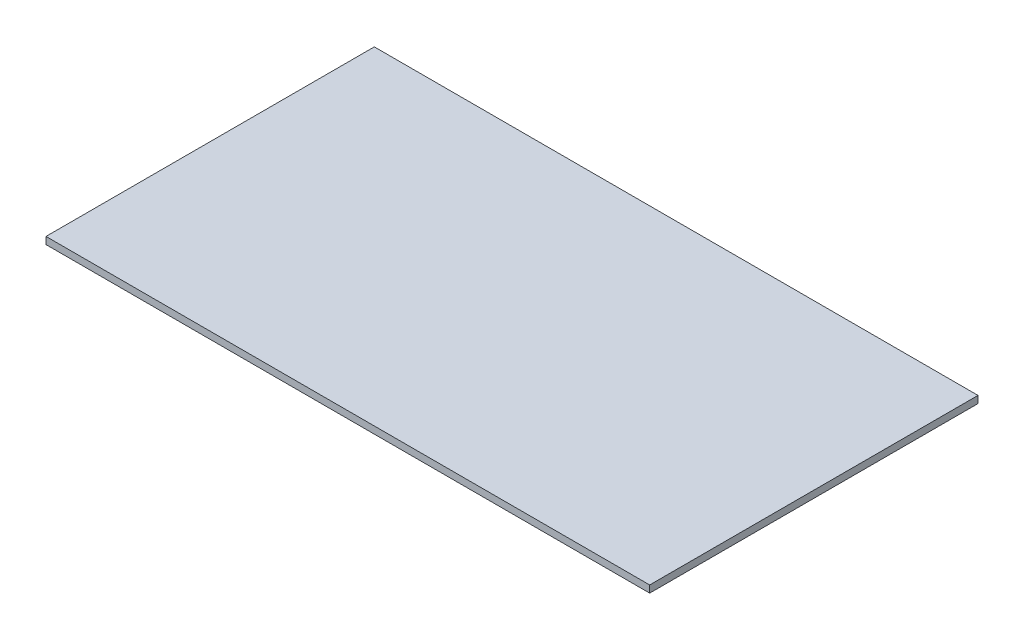
ISO-10303-21;
HEADER;
FILE_DESCRIPTION(('STEP AP214'),'2;1');
FILE_NAME('part.step','',(''),(''),'','','');
FILE_SCHEMA(('AUTOMOTIVE_DESIGN { 1 0 10303 214 1 1 1 1 }'));
ENDSEC;
DATA;
#1=APPLICATION_CONTEXT('core data for automotive mechanical design processes');
#2=APPLICATION_PROTOCOL_DEFINITION('international standard','automotive_design',2000,#1);
#3=PRODUCT_CONTEXT('',#1,'mechanical');
#4=PRODUCT('Part','Part','',(#3));
#5=PRODUCT_RELATED_PRODUCT_CATEGORY('part','',(#4));
#6=PRODUCT_DEFINITION_FORMATION('','',#4);
#7=PRODUCT_DEFINITION_CONTEXT('part definition',#1,'design');
#8=PRODUCT_DEFINITION('design','',#6,#7);
#9=PRODUCT_DEFINITION_SHAPE('','',#8);
#10=(LENGTH_UNIT() NAMED_UNIT(*) SI_UNIT(.MILLI.,.METRE.));
#11=(NAMED_UNIT(*) PLANE_ANGLE_UNIT() SI_UNIT($,.RADIAN.));
#12=(NAMED_UNIT(*) SI_UNIT($,.STERADIAN.) SOLID_ANGLE_UNIT());
#13=UNCERTAINTY_MEASURE_WITH_UNIT(LENGTH_MEASURE(1.E-05),#10,'distance_accuracy_value','');
#14=(GEOMETRIC_REPRESENTATION_CONTEXT(3) GLOBAL_UNCERTAINTY_ASSIGNED_CONTEXT((#13)) GLOBAL_UNIT_ASSIGNED_CONTEXT((#10,
#11,#12)) REPRESENTATION_CONTEXT('',''));
#15=CARTESIAN_POINT('',(0.,0.,0.));
#16=DIRECTION('',(0.,0.,1.));
#17=DIRECTION('',(1.,0.,0.));
#18=AXIS2_PLACEMENT_3D('',#15,#16,#17);
#19=CARTESIAN_POINT('',(285.,6.7,155.));
#20=DIRECTION('',(-1.,0.,0.));
#21=DIRECTION('',(0.,0.,1.));
#22=AXIS2_PLACEMENT_3D('',#19,#20,#21);
#23=PLANE('',#22);
#24=DIRECTION('',(0.,0.,-1.));
#25=VECTOR('',#24,1.);
#26=CARTESIAN_POINT('',(285.,0.,155.));
#27=LINE('',#26,#25);
#28=CARTESIAN_POINT('',(285.,0.,155.));
#29=VERTEX_POINT('',#28);
#30=CARTESIAN_POINT('',(285.,0.,-155.));
#31=VERTEX_POINT('',#30);
#32=EDGE_CURVE('E101',#29,#31,#27,.T.);
#33=ORIENTED_EDGE('',*,*,#32,.T.);
#34=DIRECTION('',(0.,-1.,0.));
#35=VECTOR('',#34,1.);
#36=CARTESIAN_POINT('',(285.,6.7,-155.));
#37=LINE('',#36,#35);
#38=CARTESIAN_POINT('',(285.,6.7,-155.));
#39=VERTEX_POINT('',#38);
#40=EDGE_CURVE('E11',#39,#31,#37,.T.);
#41=ORIENTED_EDGE('',*,*,#40,.F.);
#42=DIRECTION('',(0.,0.,-1.));
#43=VECTOR('',#42,1.);
#44=CARTESIAN_POINT('',(285.,6.7,155.));
#45=LINE('',#44,#43);
#46=CARTESIAN_POINT('',(285.,6.7,155.));
#47=VERTEX_POINT('',#46);
#48=EDGE_CURVE('E87',#47,#39,#45,.T.);
#49=ORIENTED_EDGE('',*,*,#48,.F.);
#50=DIRECTION('',(0.,-1.,0.));
#51=VECTOR('',#50,1.);
#52=CARTESIAN_POINT('',(285.,6.7,155.));
#53=LINE('',#52,#51);
#54=EDGE_CURVE('E97',#47,#29,#53,.T.);
#55=ORIENTED_EDGE('',*,*,#54,.T.);
#56=EDGE_LOOP('',(#33,#41,#49,#55));
#57=FACE_BOUND('',#56,.T.);
#58=ADVANCED_FACE('F36',(#57),#23,.F.);
#59=CARTESIAN_POINT('',(-285.,6.7,-155.));
#60=DIRECTION('',(0.,0.,1.));
#61=DIRECTION('',(1.,0.,0.));
#62=AXIS2_PLACEMENT_3D('',#59,#60,#61);
#63=PLANE('',#62);
#64=DIRECTION('',(-1.,0.,0.));
#65=VECTOR('',#64,1.);
#66=CARTESIAN_POINT('',(-285.,0.,-155.));
#67=LINE('',#66,#65);
#68=CARTESIAN_POINT('',(-285.,0.,-155.));
#69=VERTEX_POINT('',#68);
#70=EDGE_CURVE('E91',#31,#69,#67,.T.);
#71=ORIENTED_EDGE('',*,*,#70,.T.);
#72=DIRECTION('',(0.,-1.,0.));
#73=VECTOR('',#72,1.);
#74=CARTESIAN_POINT('',(-285.,6.7,-155.));
#75=LINE('',#74,#73);
#76=CARTESIAN_POINT('',(-285.,6.7,-155.));
#77=VERTEX_POINT('',#76);
#78=EDGE_CURVE('E44',#77,#69,#75,.T.);
#79=ORIENTED_EDGE('',*,*,#78,.F.);
#80=DIRECTION('',(-1.,0.,0.));
#81=VECTOR('',#80,1.);
#82=CARTESIAN_POINT('',(-285.,6.7,-155.));
#83=LINE('',#82,#81);
#84=EDGE_CURVE('E82',#39,#77,#83,.T.);
#85=ORIENTED_EDGE('',*,*,#84,.F.);
#86=ORIENTED_EDGE('',*,*,#40,.T.);
#87=EDGE_LOOP('',(#71,#79,#85,#86));
#88=FACE_BOUND('',#87,.T.);
#89=ADVANCED_FACE('F90',(#88),#63,.F.);
#90=CARTESIAN_POINT('',(-285.,6.7,155.));
#91=DIRECTION('',(1.,0.,0.));
#92=DIRECTION('',(0.,0.,-1.));
#93=AXIS2_PLACEMENT_3D('',#90,#91,#92);
#94=PLANE('',#93);
#95=DIRECTION('',(0.,0.,1.));
#96=VECTOR('',#95,1.);
#97=CARTESIAN_POINT('',(-285.,0.,155.));
#98=LINE('',#97,#96);
#99=CARTESIAN_POINT('',(-285.,0.,155.));
#100=VERTEX_POINT('',#99);
#101=EDGE_CURVE('E69',#69,#100,#98,.T.);
#102=ORIENTED_EDGE('',*,*,#101,.T.);
#103=DIRECTION('',(0.,-1.,0.));
#104=VECTOR('',#103,1.);
#105=CARTESIAN_POINT('',(-285.,6.7,155.));
#106=LINE('',#105,#104);
#107=CARTESIAN_POINT('',(-285.,6.7,155.));
#108=VERTEX_POINT('',#107);
#109=EDGE_CURVE('E92',#108,#100,#106,.T.);
#110=ORIENTED_EDGE('',*,*,#109,.F.);
#111=DIRECTION('',(0.,0.,1.));
#112=VECTOR('',#111,1.);
#113=CARTESIAN_POINT('',(-285.,6.7,155.));
#114=LINE('',#113,#112);
#115=EDGE_CURVE('E85',#77,#108,#114,.T.);
#116=ORIENTED_EDGE('',*,*,#115,.F.);
#117=ORIENTED_EDGE('',*,*,#78,.T.);
#118=EDGE_LOOP('',(#102,#110,#116,#117));
#119=FACE_BOUND('',#118,.T.);
#120=ADVANCED_FACE('F93',(#119),#94,.F.);
#121=CARTESIAN_POINT('',(-285.,6.7,155.));
#122=DIRECTION('',(0.,0.,-1.));
#123=DIRECTION('',(-1.,0.,0.));
#124=AXIS2_PLACEMENT_3D('',#121,#122,#123);
#125=PLANE('',#124);
#126=DIRECTION('',(1.,0.,0.));
#127=VECTOR('',#126,1.);
#128=CARTESIAN_POINT('',(-285.,0.,155.));
#129=LINE('',#128,#127);
#130=EDGE_CURVE('E75',#100,#29,#129,.T.);
#131=ORIENTED_EDGE('',*,*,#130,.T.);
#132=ORIENTED_EDGE('',*,*,#54,.F.);
#133=DIRECTION('',(1.,0.,0.));
#134=VECTOR('',#133,1.);
#135=CARTESIAN_POINT('',(-285.,6.7,155.));
#136=LINE('',#135,#134);
#137=EDGE_CURVE('E52',#108,#47,#136,.T.);
#138=ORIENTED_EDGE('',*,*,#137,.F.);
#139=ORIENTED_EDGE('',*,*,#109,.T.);
#140=EDGE_LOOP('',(#131,#132,#138,#139));
#141=FACE_BOUND('',#140,.T.);
#142=ADVANCED_FACE('F108',(#141),#125,.F.);
#143=CARTESIAN_POINT('',(0.,6.7,0.));
#144=DIRECTION('',(0.,-1.,0.));
#145=DIRECTION('',(0.,0.,-1.));
#146=AXIS2_PLACEMENT_3D('',#143,#144,#145);
#147=PLANE('',#146);
#148=ORIENTED_EDGE('',*,*,#48,.T.);
#149=ORIENTED_EDGE('',*,*,#84,.T.);
#150=ORIENTED_EDGE('',*,*,#115,.T.);
#151=ORIENTED_EDGE('',*,*,#137,.T.);
#152=EDGE_LOOP('',(#148,#149,#150,#151));
#153=FACE_BOUND('',#152,.T.);
#154=ADVANCED_FACE('F83',(#153),#147,.F.);
#155=CARTESIAN_POINT('',(0.,0.,0.));
#156=DIRECTION('',(0.,-1.,0.));
#157=DIRECTION('',(0.,0.,-1.));
#158=AXIS2_PLACEMENT_3D('',#155,#156,#157);
#159=PLANE('',#158);
#160=ORIENTED_EDGE('',*,*,#32,.F.);
#161=ORIENTED_EDGE('',*,*,#130,.F.);
#162=ORIENTED_EDGE('',*,*,#101,.F.);
#163=ORIENTED_EDGE('',*,*,#70,.F.);
#164=EDGE_LOOP('',(#160,#161,#162,#163));
#165=FACE_BOUND('',#164,.T.);
#166=ADVANCED_FACE('F111',(#165),#159,.T.);
#167=CLOSED_SHELL('',(#58,#89,#120,#142,#154,#166));
#168=MANIFOLD_SOLID_BREP('B2',#167);
#169=ADVANCED_BREP_SHAPE_REPRESENTATION('',(#18,#168),#14);
#170=SHAPE_DEFINITION_REPRESENTATION(#9,#169);
ENDSEC;
END-ISO-10303-21;
